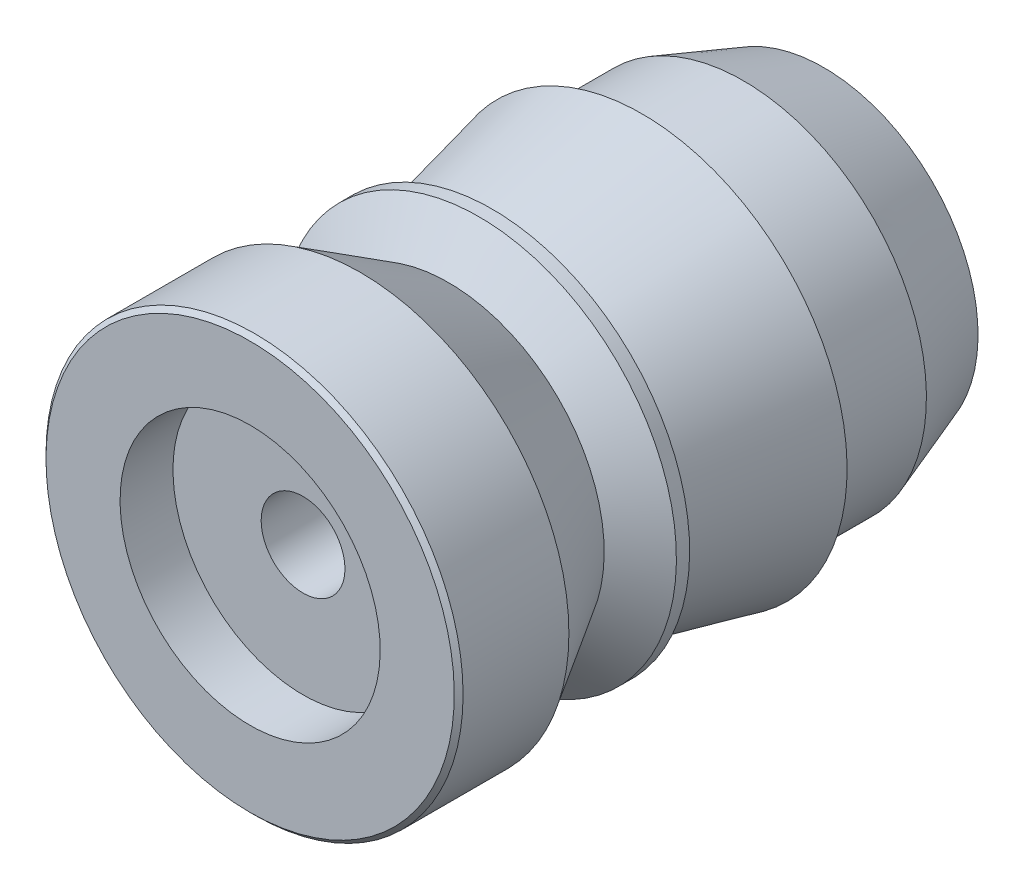
ISO-10303-21;
HEADER;
FILE_DESCRIPTION(('STEP AP214'),'2;1');
FILE_NAME('part.step','',(''),(''),'','','');
FILE_SCHEMA(('AUTOMOTIVE_DESIGN { 1 0 10303 214 1 1 1 1 }'));
ENDSEC;
DATA;
#1=APPLICATION_CONTEXT('core data for automotive mechanical design processes');
#2=APPLICATION_PROTOCOL_DEFINITION('international standard','automotive_design',2000,#1);
#3=PRODUCT_CONTEXT('',#1,'mechanical');
#4=PRODUCT('Part','Part','',(#3));
#5=PRODUCT_RELATED_PRODUCT_CATEGORY('part','',(#4));
#6=PRODUCT_DEFINITION_FORMATION('','',#4);
#7=PRODUCT_DEFINITION_CONTEXT('part definition',#1,'design');
#8=PRODUCT_DEFINITION('design','',#6,#7);
#9=PRODUCT_DEFINITION_SHAPE('','',#8);
#10=(LENGTH_UNIT() NAMED_UNIT(*) SI_UNIT(.MILLI.,.METRE.));
#11=(NAMED_UNIT(*) PLANE_ANGLE_UNIT() SI_UNIT($,.RADIAN.));
#12=(NAMED_UNIT(*) SI_UNIT($,.STERADIAN.) SOLID_ANGLE_UNIT());
#13=UNCERTAINTY_MEASURE_WITH_UNIT(LENGTH_MEASURE(1.E-05),#10,'distance_accuracy_value','');
#14=(GEOMETRIC_REPRESENTATION_CONTEXT(3) GLOBAL_UNCERTAINTY_ASSIGNED_CONTEXT((#13)) GLOBAL_UNIT_ASSIGNED_CONTEXT((#10,
#11,#12)) REPRESENTATION_CONTEXT('',''));
#15=CARTESIAN_POINT('',(0.,0.,0.));
#16=DIRECTION('',(0.,0.,1.));
#17=DIRECTION('',(1.,0.,0.));
#18=AXIS2_PLACEMENT_3D('',#15,#16,#17);
#19=CARTESIAN_POINT('',(0.,0.,-65.0442794950947));
#20=DIRECTION('',(0.,0.,1.));
#21=DIRECTION('',(0.,-1.,0.));
#22=AXIS2_PLACEMENT_3D('',#19,#20,#21);
#23=PLANE('',#22);
#24=CARTESIAN_POINT('',(0.,-0.148675882768928,-65.0442794950947));
#25=DIRECTION('',(0.,0.,1.));
#26=DIRECTION('',(0.,-1.,0.));
#27=AXIS2_PLACEMENT_3D('',#24,#25,#26);
#28=CIRCLE('',#27,17.5);
#29=CARTESIAN_POINT('',(0.,-17.6486758827689,-65.0442794950947));
#30=VERTEX_POINT('',#29);
#31=EDGE_CURVE('E65',#30,#30,#28,.T.);
#32=ORIENTED_EDGE('',*,*,#31,.F.);
#33=EDGE_LOOP('',(#32));
#34=FACE_BOUND('',#33,.T.);
#35=ADVANCED_FACE('F43',(#34),#23,.F.);
#36=CARTESIAN_POINT('',(0.,-0.148675882768928,-55.9420050587701));
#37=DIRECTION('',(0.,0.,1.));
#38=DIRECTION('',(0.,-1.,0.));
#39=AXIS2_PLACEMENT_3D('',#36,#37,#38);
#40=CONICAL_SURFACE('',#39,20.75,0.342944792064638);
#41=ORIENTED_EDGE('',*,*,#31,.T.);
#42=EDGE_LOOP('',(#41));
#43=FACE_BOUND('',#42,.T.);
#44=CARTESIAN_POINT('',(0.,-0.148675882768928,-55.9420050587701));
#45=DIRECTION('',(0.,0.,1.));
#46=DIRECTION('',(0.,-1.,0.));
#47=AXIS2_PLACEMENT_3D('',#44,#45,#46);
#48=CIRCLE('',#47,20.75);
#49=CARTESIAN_POINT('',(0.,-20.8986758827689,-55.9420050587701));
#50=VERTEX_POINT('',#49);
#51=EDGE_CURVE('E71',#50,#50,#48,.T.);
#52=ORIENTED_EDGE('',*,*,#51,.F.);
#53=EDGE_LOOP('',(#52));
#54=FACE_BOUND('',#53,.T.);
#55=ADVANCED_FACE('F131',(#43,#54),#40,.T.);
#56=CARTESIAN_POINT('',(0.,-0.148675882768929,-44.4420050587701));
#57=DIRECTION('',(0.,0.,1.));
#58=DIRECTION('',(0.,-1.,0.));
#59=AXIS2_PLACEMENT_3D('',#56,#57,#58);
#60=CYLINDRICAL_SURFACE('',#59,20.75);
#61=ORIENTED_EDGE('',*,*,#51,.T.);
#62=EDGE_LOOP('',(#61));
#63=FACE_BOUND('',#62,.T.);
#64=CARTESIAN_POINT('',(0.,-0.148675882768929,-44.4420050587701));
#65=DIRECTION('',(0.,0.,1.));
#66=DIRECTION('',(0.,-1.,0.));
#67=AXIS2_PLACEMENT_3D('',#64,#65,#66);
#68=CIRCLE('',#67,20.75);
#69=CARTESIAN_POINT('',(0.,-20.8986758827689,-44.4420050587701));
#70=VERTEX_POINT('',#69);
#71=EDGE_CURVE('E121',#70,#70,#68,.T.);
#72=ORIENTED_EDGE('',*,*,#71,.F.);
#73=EDGE_LOOP('',(#72));
#74=FACE_BOUND('',#73,.T.);
#75=ADVANCED_FACE('F128',(#63,#74),#60,.T.);
#76=CARTESIAN_POINT('',(0.,0.,-44.4420050587701));
#77=DIRECTION('',(0.,0.,1.));
#78=DIRECTION('',(0.,-1.,0.));
#79=AXIS2_PLACEMENT_3D('',#76,#77,#78);
#80=PLANE('',#79);
#81=CARTESIAN_POINT('',(0.,-0.148675882768929,-44.4420050587701));
#82=DIRECTION('',(0.,0.,1.));
#83=DIRECTION('',(0.,-1.,0.));
#84=AXIS2_PLACEMENT_3D('',#81,#82,#83);
#85=CIRCLE('',#84,23.25);
#86=CARTESIAN_POINT('',(0.,-23.3986758827689,-44.4420050587701));
#87=VERTEX_POINT('',#86);
#88=EDGE_CURVE('E117',#87,#87,#85,.T.);
#89=ORIENTED_EDGE('',*,*,#88,.F.);
#90=EDGE_LOOP('',(#89));
#91=FACE_BOUND('',#90,.T.);
#92=ORIENTED_EDGE('',*,*,#71,.T.);
#93=EDGE_LOOP('',(#92));
#94=FACE_BOUND('',#93,.T.);
#95=ADVANCED_FACE('F139',(#91,#94),#80,.F.);
#96=CARTESIAN_POINT('',(0.,-0.14867588276893,-27.4420050587701));
#97=DIRECTION('',(0.,0.,-1.));
#98=DIRECTION('',(0.,1.,0.));
#99=AXIS2_PLACEMENT_3D('',#96,#97,#98);
#100=CONICAL_SURFACE('',#99,19.3986758827689,0.222787815843956);
#101=ORIENTED_EDGE('',*,*,#88,.T.);
#102=EDGE_LOOP('',(#101));
#103=FACE_BOUND('',#102,.T.);
#104=CARTESIAN_POINT('',(0.,-0.14867588276893,-27.4420050587701));
#105=DIRECTION('',(0.,0.,1.));
#106=DIRECTION('',(0.,-1.,0.));
#107=AXIS2_PLACEMENT_3D('',#104,#105,#106);
#108=CIRCLE('',#107,19.3986758827689);
#109=CARTESIAN_POINT('',(0.,-19.5473517655379,-27.4420050587701));
#110=VERTEX_POINT('',#109);
#111=EDGE_CURVE('E113',#110,#110,#108,.T.);
#112=ORIENTED_EDGE('',*,*,#111,.F.);
#113=EDGE_LOOP('',(#112));
#114=FACE_BOUND('',#113,.T.);
#115=ADVANCED_FACE('F193',(#103,#114),#100,.T.);
#116=CARTESIAN_POINT('',(0.,0.,-27.4420050587701));
#117=DIRECTION('',(0.,0.,1.));
#118=DIRECTION('',(0.,-1.,0.));
#119=AXIS2_PLACEMENT_3D('',#116,#117,#118);
#120=PLANE('',#119);
#121=CARTESIAN_POINT('',(0.,-0.14867588276893,-27.4420050587701));
#122=DIRECTION('',(0.,0.,1.));
#123=DIRECTION('',(0.,-1.,0.));
#124=AXIS2_PLACEMENT_3D('',#121,#122,#123);
#125=CIRCLE('',#124,22.3986758827689);
#126=CARTESIAN_POINT('',(0.,-22.5473517655379,-27.4420050587701));
#127=VERTEX_POINT('',#126);
#128=EDGE_CURVE('E109',#127,#127,#125,.T.);
#129=ORIENTED_EDGE('',*,*,#128,.F.);
#130=EDGE_LOOP('',(#129));
#131=FACE_BOUND('',#130,.T.);
#132=ORIENTED_EDGE('',*,*,#111,.T.);
#133=EDGE_LOOP('',(#132));
#134=FACE_BOUND('',#133,.T.);
#135=ADVANCED_FACE('F189',(#131,#134),#120,.F.);
#136=CARTESIAN_POINT('',(0.,-0.148675882768929,-44.4420050587701));
#137=DIRECTION('',(0.,0.,1.));
#138=DIRECTION('',(0.,-1.,0.));
#139=AXIS2_PLACEMENT_3D('',#136,#137,#138);
#140=CYLINDRICAL_SURFACE('',#139,22.3986758827689);
#141=ORIENTED_EDGE('',*,*,#128,.T.);
#142=EDGE_LOOP('',(#141));
#143=FACE_BOUND('',#142,.T.);
#144=CARTESIAN_POINT('',(0.,-0.14867588276893,-25.9420050587701));
#145=DIRECTION('',(0.,0.,1.));
#146=DIRECTION('',(0.,-1.,0.));
#147=AXIS2_PLACEMENT_3D('',#144,#145,#146);
#148=CIRCLE('',#147,22.3986758827689);
#149=CARTESIAN_POINT('',(0.,-22.5473517655379,-25.9420050587701));
#150=VERTEX_POINT('',#149);
#151=EDGE_CURVE('E105',#150,#150,#148,.T.);
#152=ORIENTED_EDGE('',*,*,#151,.F.);
#153=EDGE_LOOP('',(#152));
#154=FACE_BOUND('',#153,.T.);
#155=ADVANCED_FACE('F185',(#143,#154),#140,.T.);
#156=CARTESIAN_POINT('',(0.,-0.14867588276893,-22.5));
#157=DIRECTION('',(0.,0.,-1.));
#158=DIRECTION('',(0.,1.,0.));
#159=AXIS2_PLACEMENT_3D('',#156,#157,#158);
#160=CONICAL_SURFACE('',#159,17.6486758827689,0.943728967084803);
#161=ORIENTED_EDGE('',*,*,#151,.T.);
#162=EDGE_LOOP('',(#161));
#163=FACE_BOUND('',#162,.T.);
#164=CARTESIAN_POINT('',(0.,-0.14867588276893,-22.5));
#165=DIRECTION('',(0.,0.,1.));
#166=DIRECTION('',(0.,-1.,0.));
#167=AXIS2_PLACEMENT_3D('',#164,#165,#166);
#168=CIRCLE('',#167,17.6486758827689);
#169=CARTESIAN_POINT('',(0.,-17.7973517655379,-22.5));
#170=VERTEX_POINT('',#169);
#171=EDGE_CURVE('E101',#170,#170,#168,.T.);
#172=ORIENTED_EDGE('',*,*,#171,.F.);
#173=EDGE_LOOP('',(#172));
#174=FACE_BOUND('',#173,.T.);
#175=ADVANCED_FACE('F181',(#163,#174),#160,.T.);
#176=CARTESIAN_POINT('',(0.,-0.148675882768931,-12.5));
#177=DIRECTION('',(0.,0.,1.));
#178=DIRECTION('',(0.,-1.,0.));
#179=AXIS2_PLACEMENT_3D('',#176,#177,#178);
#180=CONICAL_SURFACE('',#179,23.6486758827689,0.540419500270584);
#181=ORIENTED_EDGE('',*,*,#171,.T.);
#182=EDGE_LOOP('',(#181));
#183=FACE_BOUND('',#182,.T.);
#184=CARTESIAN_POINT('',(0.,-0.148675882768931,-12.5));
#185=DIRECTION('',(0.,0.,1.));
#186=DIRECTION('',(0.,-1.,0.));
#187=AXIS2_PLACEMENT_3D('',#184,#185,#186);
#188=CIRCLE('',#187,23.6486758827689);
#189=CARTESIAN_POINT('',(0.,-23.7973517655379,-12.5));
#190=VERTEX_POINT('',#189);
#191=EDGE_CURVE('E94',#190,#190,#188,.T.);
#192=ORIENTED_EDGE('',*,*,#191,.F.);
#193=EDGE_LOOP('',(#192));
#194=FACE_BOUND('',#193,.T.);
#195=ADVANCED_FACE('F177',(#183,#194),#180,.T.);
#196=CARTESIAN_POINT('',(0.,-0.148675882768929,-44.4420050587701));
#197=DIRECTION('',(0.,0.,1.));
#198=DIRECTION('',(0.,-1.,0.));
#199=AXIS2_PLACEMENT_3D('',#196,#197,#198);
#200=CYLINDRICAL_SURFACE('',#199,23.6486758827689);
#201=CARTESIAN_POINT('',(0.,-0.148675882768932,-0.500000000000007));
#202=DIRECTION('',(0.,0.,1.));
#203=DIRECTION('',(0.,-1.,0.));
#204=AXIS2_PLACEMENT_3D('',#201,#202,#203);
#205=CIRCLE('',#204,23.6486758827689);
#206=CARTESIAN_POINT('',(0.,-23.7973517655379,-0.500000000000009));
#207=VERTEX_POINT('',#206);
#208=EDGE_CURVE('E12',#207,#207,#205,.F.);
#209=ORIENTED_EDGE('',*,*,#208,.T.);
#210=EDGE_LOOP('',(#209));
#211=FACE_BOUND('',#210,.T.);
#212=ORIENTED_EDGE('',*,*,#191,.T.);
#213=EDGE_LOOP('',(#212));
#214=FACE_BOUND('',#213,.T.);
#215=ADVANCED_FACE('F173',(#211,#214),#200,.T.);
#216=CARTESIAN_POINT('',(0.,0.,0.));
#217=DIRECTION('',(0.,0.,1.));
#218=DIRECTION('',(0.,-1.,0.));
#219=AXIS2_PLACEMENT_3D('',#216,#217,#218);
#220=PLANE('',#219);
#221=CARTESIAN_POINT('',(0.,-0.148675882768932,0.));
#222=DIRECTION('',(0.,0.,1.));
#223=DIRECTION('',(0.,-1.,0.));
#224=AXIS2_PLACEMENT_3D('',#221,#222,#223);
#225=CIRCLE('',#224,23.1486758827689);
#226=CARTESIAN_POINT('',(0.,-23.2973517655379,0.));
#227=VERTEX_POINT('',#226);
#228=EDGE_CURVE('E51',#227,#227,#225,.T.);
#229=ORIENTED_EDGE('',*,*,#228,.T.);
#230=EDGE_LOOP('',(#229));
#231=FACE_BOUND('',#230,.T.);
#232=CARTESIAN_POINT('',(0.,0.,0.));
#233=DIRECTION('',(0.,0.,1.));
#234=DIRECTION('',(1.,0.,0.));
#235=AXIS2_PLACEMENT_3D('',#232,#233,#234);
#236=CIRCLE('',#235,14.75);
#237=CARTESIAN_POINT('',(0.,14.75,0.));
#238=VERTEX_POINT('',#237);
#239=EDGE_CURVE('E83',#238,#238,#236,.T.);
#240=ORIENTED_EDGE('',*,*,#239,.F.);
#241=EDGE_LOOP('',(#240));
#242=FACE_BOUND('',#241,.T.);
#243=ADVANCED_FACE('F169',(#231,#242),#220,.T.);
#244=CARTESIAN_POINT('',(0.,0.,-6.));
#245=DIRECTION('',(0.,0.,-1.));
#246=DIRECTION('',(-1.,0.,0.));
#247=AXIS2_PLACEMENT_3D('',#244,#245,#246);
#248=PLANE('',#247);
#249=CARTESIAN_POINT('',(0.,0.,-6.));
#250=DIRECTION('',(0.,0.,-1.));
#251=DIRECTION('',(-1.,0.,0.));
#252=AXIS2_PLACEMENT_3D('',#249,#250,#251);
#253=CIRCLE('',#252,4.75);
#254=CARTESIAN_POINT('',(-4.75,0.,-6.));
#255=VERTEX_POINT('',#254);
#256=EDGE_CURVE('E79',#255,#255,#253,.F.);
#257=ORIENTED_EDGE('',*,*,#256,.F.);
#258=EDGE_LOOP('',(#257));
#259=FACE_BOUND('',#258,.T.);
#260=CARTESIAN_POINT('',(0.,0.,-6.));
#261=DIRECTION('',(0.,0.,1.));
#262=DIRECTION('',(1.,0.,0.));
#263=AXIS2_PLACEMENT_3D('',#260,#261,#262);
#264=CIRCLE('',#263,14.75);
#265=CARTESIAN_POINT('',(0.,14.75,-6.));
#266=VERTEX_POINT('',#265);
#267=EDGE_CURVE('E88',#266,#266,#264,.T.);
#268=ORIENTED_EDGE('',*,*,#267,.T.);
#269=EDGE_LOOP('',(#268));
#270=FACE_BOUND('',#269,.T.);
#271=ADVANCED_FACE('F166',(#259,#270),#248,.F.);
#272=CARTESIAN_POINT('',(0.,0.,0.));
#273=DIRECTION('',(0.,0.,-1.));
#274=DIRECTION('',(0.,1.,0.));
#275=AXIS2_PLACEMENT_3D('',#272,#273,#274);
#276=CYLINDRICAL_SURFACE('',#275,14.75);
#277=CARTESIAN_POINT('',(0.,14.75,0.));
#278=CARTESIAN_POINT('',(0.,14.75,-0.0624999999999999));
#279=CARTESIAN_POINT('',(0.,14.75,-0.125));
#280=CARTESIAN_POINT('',(0.,14.75,-0.25));
#281=CARTESIAN_POINT('',(0.,14.75,-0.3125));
#282=CARTESIAN_POINT('',(0.,14.75,-0.4375));
#283=CARTESIAN_POINT('',(0.,14.75,-0.5));
#284=CARTESIAN_POINT('',(0.,14.75,-0.625));
#285=CARTESIAN_POINT('',(0.,14.75,-0.6875));
#286=CARTESIAN_POINT('',(0.,14.75,-0.8125));
#287=CARTESIAN_POINT('',(0.,14.75,-0.875));
#288=CARTESIAN_POINT('',(0.,14.75,-1.));
#289=CARTESIAN_POINT('',(0.,14.75,-1.0625));
#290=CARTESIAN_POINT('',(0.,14.75,-1.1875));
#291=CARTESIAN_POINT('',(0.,14.75,-1.25));
#292=CARTESIAN_POINT('',(0.,14.75,-1.375));
#293=CARTESIAN_POINT('',(0.,14.75,-1.4375));
#294=CARTESIAN_POINT('',(0.,14.75,-1.5625));
#295=CARTESIAN_POINT('',(0.,14.75,-1.625));
#296=CARTESIAN_POINT('',(0.,14.75,-1.75));
#297=CARTESIAN_POINT('',(0.,14.75,-1.8125));
#298=CARTESIAN_POINT('',(0.,14.75,-1.9375));
#299=CARTESIAN_POINT('',(0.,14.75,-2.));
#300=CARTESIAN_POINT('',(0.,14.75,-2.125));
#301=CARTESIAN_POINT('',(0.,14.75,-2.1875));
#302=CARTESIAN_POINT('',(0.,14.75,-2.3125));
#303=CARTESIAN_POINT('',(0.,14.75,-2.375));
#304=CARTESIAN_POINT('',(0.,14.75,-2.5));
#305=CARTESIAN_POINT('',(0.,14.75,-2.5625));
#306=CARTESIAN_POINT('',(0.,14.75,-2.6875));
#307=CARTESIAN_POINT('',(0.,14.75,-2.75));
#308=CARTESIAN_POINT('',(0.,14.75,-2.875));
#309=CARTESIAN_POINT('',(0.,14.75,-2.9375));
#310=CARTESIAN_POINT('',(0.,14.75,-3.0625));
#311=CARTESIAN_POINT('',(0.,14.75,-3.125));
#312=CARTESIAN_POINT('',(0.,14.75,-3.25));
#313=CARTESIAN_POINT('',(0.,14.75,-3.3125));
#314=CARTESIAN_POINT('',(0.,14.75,-3.4375));
#315=CARTESIAN_POINT('',(0.,14.75,-3.5));
#316=CARTESIAN_POINT('',(0.,14.75,-3.625));
#317=CARTESIAN_POINT('',(0.,14.75,-3.6875));
#318=CARTESIAN_POINT('',(0.,14.75,-3.8125));
#319=CARTESIAN_POINT('',(0.,14.75,-3.875));
#320=CARTESIAN_POINT('',(0.,14.75,-4.));
#321=CARTESIAN_POINT('',(0.,14.75,-4.0625));
#322=CARTESIAN_POINT('',(0.,14.75,-4.1875));
#323=CARTESIAN_POINT('',(0.,14.75,-4.25));
#324=CARTESIAN_POINT('',(0.,14.75,-4.375));
#325=CARTESIAN_POINT('',(0.,14.75,-4.4375));
#326=CARTESIAN_POINT('',(0.,14.75,-4.5625));
#327=CARTESIAN_POINT('',(0.,14.75,-4.625));
#328=CARTESIAN_POINT('',(0.,14.75,-4.75));
#329=CARTESIAN_POINT('',(0.,14.75,-4.8125));
#330=CARTESIAN_POINT('',(0.,14.75,-4.9375));
#331=CARTESIAN_POINT('',(0.,14.75,-5.));
#332=CARTESIAN_POINT('',(0.,14.75,-5.125));
#333=CARTESIAN_POINT('',(0.,14.75,-5.1875));
#334=CARTESIAN_POINT('',(0.,14.75,-5.3125));
#335=CARTESIAN_POINT('',(0.,14.75,-5.375));
#336=CARTESIAN_POINT('',(0.,14.75,-5.5));
#337=CARTESIAN_POINT('',(0.,14.75,-5.5625));
#338=CARTESIAN_POINT('',(0.,14.75,-5.6875));
#339=CARTESIAN_POINT('',(0.,14.75,-5.75));
#340=CARTESIAN_POINT('',(0.,14.75,-5.875));
#341=CARTESIAN_POINT('',(0.,14.75,-5.9375));
#342=CARTESIAN_POINT('',(0.,14.75,-6.));
#343=B_SPLINE_CURVE_WITH_KNOTS('',3,(#277,#278,#279,#280,#281,#282,#283,#284,#285,#286,#287,
#288,#289,#290,#291,#292,#293,#294,#295,#296,#297,#298,#299,#300,#301,#302,#303,#304,#305,#306,
#307,#308,#309,#310,#311,#312,#313,#314,#315,#316,#317,#318,#319,#320,#321,#322,#323,#324,#325,
#326,#327,#328,#329,#330,#331,#332,#333,#334,#335,#336,#337,#338,#339,#340,#341,#342),
.UNSPECIFIED.,.F.,.F.,(4,2,2,2,2,2,2,2,2,2,2,2,2,2,2,2,2,2,2,2,2,2,2,2,2,2,2,2,2,2,2,2,4),(0.,
0.1875,0.375,0.5625,0.75,0.9375,1.125,1.3125,1.5,1.6875,1.875,2.0625,2.25,2.4375,2.625,2.8125,
3.,3.1875,3.375,3.5625,3.75,3.9375,4.125,4.3125,4.5,4.6875,4.875,5.0625,5.25,5.4375,5.625,
5.8125,6.),.UNSPECIFIED.);
#344=EDGE_CURVE('BSEAM159',#238,#266,#343,.T.);
#345=ORIENTED_EDGE('',*,*,#239,.T.);
#346=ORIENTED_EDGE('',*,*,#267,.F.);
#347=ORIENTED_EDGE('',*,*,#344,.T.);
#348=ORIENTED_EDGE('',*,*,#344,.F.);
#349=EDGE_LOOP('',(#345,#347,#346,#348));
#350=FACE_BOUND('',#349,.T.);
#351=ADVANCED_FACE('F159',(#350),#276,.F.);
#352=CARTESIAN_POINT('',(0.,0.,0.));
#353=DIRECTION('',(0.,0.,-1.));
#354=DIRECTION('',(-1.,0.,0.));
#355=AXIS2_PLACEMENT_3D('',#352,#353,#354);
#356=CYLINDRICAL_SURFACE('',#355,4.75);
#357=CARTESIAN_POINT('',(0.,0.,-24.));
#358=DIRECTION('',(0.,0.,1.));
#359=DIRECTION('',(1.,0.,0.));
#360=AXIS2_PLACEMENT_3D('',#357,#358,#359);
#361=CIRCLE('',#360,4.75);
#362=CARTESIAN_POINT('',(4.75,0.,-24.));
#363=VERTEX_POINT('',#362);
#364=EDGE_CURVE('E80',#363,#363,#361,.T.);
#365=ORIENTED_EDGE('',*,*,#364,.F.);
#366=EDGE_LOOP('',(#365));
#367=FACE_BOUND('',#366,.T.);
#368=ORIENTED_EDGE('',*,*,#256,.T.);
#369=EDGE_LOOP('',(#368));
#370=FACE_BOUND('',#369,.T.);
#371=ADVANCED_FACE('F153',(#367,#370),#356,.F.);
#372=CARTESIAN_POINT('',(0.,0.,-24.));
#373=DIRECTION('',(0.,0.,-1.));
#374=DIRECTION('',(-1.,0.,0.));
#375=AXIS2_PLACEMENT_3D('',#372,#373,#374);
#376=PLANE('',#375);
#377=ORIENTED_EDGE('',*,*,#364,.T.);
#378=EDGE_LOOP('',(#377));
#379=FACE_BOUND('',#378,.T.);
#380=CARTESIAN_POINT('',(0.,-0.14867588276893,-24.));
#381=DIRECTION('',(0.,0.,-1.));
#382=DIRECTION('',(-1.,0.,0.));
#383=AXIS2_PLACEMENT_3D('',#380,#381,#382);
#384=CIRCLE('',#383,0.148675882768931);
#385=CARTESIAN_POINT('',(-0.148675882768931,-0.14867588276893,-24.));
#386=VERTEX_POINT('',#385);
#387=EDGE_CURVE('E75',#386,#386,#384,.F.);
#388=ORIENTED_EDGE('',*,*,#387,.F.);
#389=EDGE_LOOP('',(#388));
#390=FACE_BOUND('',#389,.T.);
#391=ADVANCED_FACE('F58',(#379,#390),#376,.F.);
#392=CARTESIAN_POINT('',(0.,-0.14867588276893,-27.4420050587701));
#393=DIRECTION('',(0.,0.,1.));
#394=DIRECTION('',(0.,-1.,0.));
#395=AXIS2_PLACEMENT_3D('',#392,#393,#394);
#396=CONICAL_SURFACE('',#395,0.14867588276893,0.00874541719945239);
#397=CARTESIAN_POINT('',(0.,-0.148675882768929,-44.4420050587701));
#398=VERTEX_POINT('',#397);
#399=VERTEX_LOOP('',#398);
#400=FACE_BOUND('',#399,.T.);
#401=CARTESIAN_POINT('',(0.,-0.14867588276893,-27.4420050587701));
#402=DIRECTION('',(0.,0.,1.));
#403=DIRECTION('',(0.,-1.,0.));
#404=AXIS2_PLACEMENT_3D('',#401,#402,#403);
#405=CIRCLE('',#404,0.14867588276893);
#406=CARTESIAN_POINT('',(0.,-0.29735176553786,-27.4420050587701));
#407=VERTEX_POINT('',#406);
#408=EDGE_CURVE('E62',#407,#407,#405,.T.);
#409=ORIENTED_EDGE('',*,*,#408,.T.);
#410=EDGE_LOOP('',(#409));
#411=FACE_BOUND('',#410,.T.);
#412=ADVANCED_FACE('F54',(#400,#411),#396,.F.);
#413=CARTESIAN_POINT('',(0.,-0.148675882768929,-44.4420050587701));
#414=DIRECTION('',(0.,0.,1.));
#415=DIRECTION('',(0.,-1.,0.));
#416=AXIS2_PLACEMENT_3D('',#413,#414,#415);
#417=CYLINDRICAL_SURFACE('',#416,0.148675882768931);
#418=ORIENTED_EDGE('',*,*,#387,.T.);
#419=EDGE_LOOP('',(#418));
#420=FACE_BOUND('',#419,.T.);
#421=ORIENTED_EDGE('',*,*,#408,.F.);
#422=EDGE_LOOP('',(#421));
#423=FACE_BOUND('',#422,.T.);
#424=ADVANCED_FACE('F57',(#420,#423),#417,.F.);
#425=CARTESIAN_POINT('',(0.,-0.148675882768932,0.));
#426=DIRECTION('',(0.,0.,-1.));
#427=DIRECTION('',(0.,1.,0.));
#428=AXIS2_PLACEMENT_3D('',#425,#426,#427);
#429=CONICAL_SURFACE('',#428,23.1486758827689,0.785398163397448);
#430=ORIENTED_EDGE('',*,*,#208,.F.);
#431=EDGE_LOOP('',(#430));
#432=FACE_BOUND('',#431,.T.);
#433=ORIENTED_EDGE('',*,*,#228,.F.);
#434=EDGE_LOOP('',(#433));
#435=FACE_BOUND('',#434,.T.);
#436=ADVANCED_FACE('F45',(#432,#435),#429,.T.);
#437=CLOSED_SHELL('',(#35,#55,#75,#95,#115,#135,#155,#175,#195,#215,#243,#271,#351,#371,#391,
#412,#424,#436));
#438=MANIFOLD_SOLID_BREP('B2',#437);
#439=ADVANCED_BREP_SHAPE_REPRESENTATION('',(#18,#438),#14);
#440=SHAPE_DEFINITION_REPRESENTATION(#9,#439);
ENDSEC;
END-ISO-10303-21;
